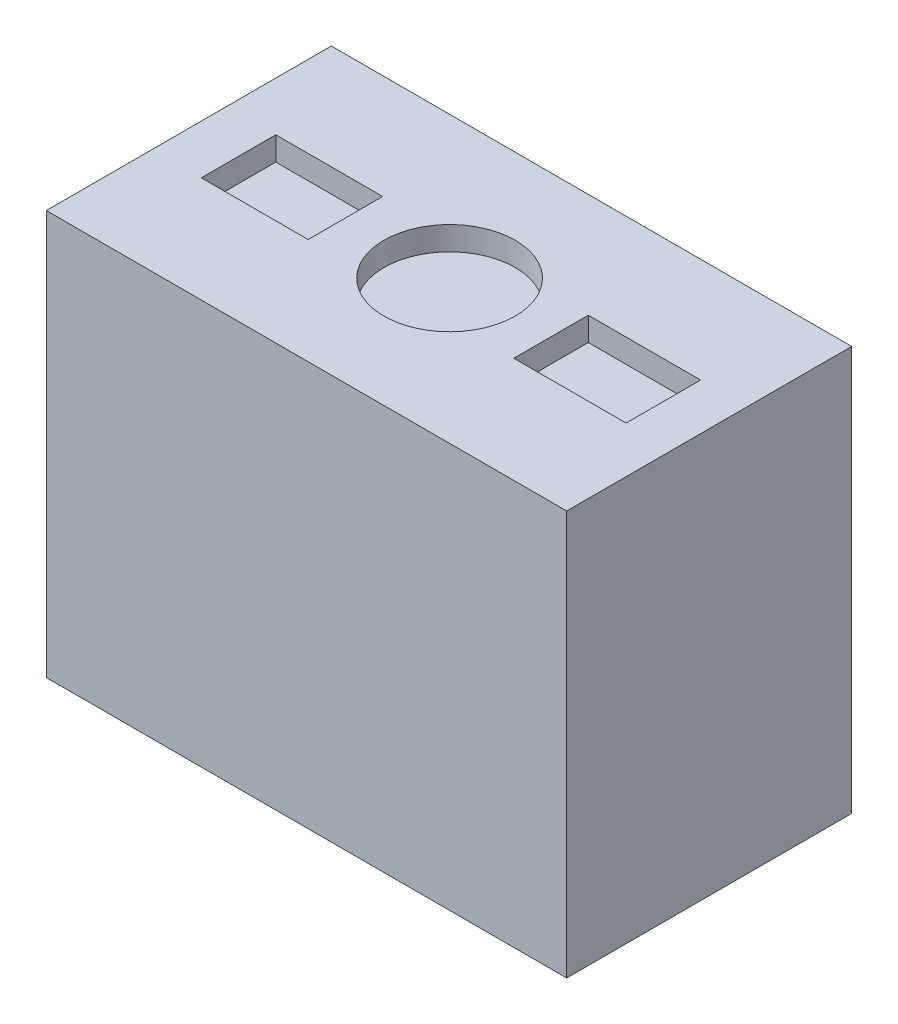
ISO-10303-21;
HEADER;
FILE_DESCRIPTION(('STEP AP214'),'2;1');
FILE_NAME('part.step','',(''),(''),'','','');
FILE_SCHEMA(('AUTOMOTIVE_DESIGN { 1 0 10303 214 1 1 1 1 }'));
ENDSEC;
DATA;
#1=APPLICATION_CONTEXT('core data for automotive mechanical design processes');
#2=APPLICATION_PROTOCOL_DEFINITION('international standard','automotive_design',2000,#1);
#3=PRODUCT_CONTEXT('',#1,'mechanical');
#4=PRODUCT('Part','Part','',(#3));
#5=PRODUCT_RELATED_PRODUCT_CATEGORY('part','',(#4));
#6=PRODUCT_DEFINITION_FORMATION('','',#4);
#7=PRODUCT_DEFINITION_CONTEXT('part definition',#1,'design');
#8=PRODUCT_DEFINITION('design','',#6,#7);
#9=PRODUCT_DEFINITION_SHAPE('','',#8);
#10=(LENGTH_UNIT() NAMED_UNIT(*) SI_UNIT(.MILLI.,.METRE.));
#11=(NAMED_UNIT(*) PLANE_ANGLE_UNIT() SI_UNIT($,.RADIAN.));
#12=(NAMED_UNIT(*) SI_UNIT($,.STERADIAN.) SOLID_ANGLE_UNIT());
#13=UNCERTAINTY_MEASURE_WITH_UNIT(LENGTH_MEASURE(1.E-05),#10,'distance_accuracy_value','');
#14=(GEOMETRIC_REPRESENTATION_CONTEXT(3) GLOBAL_UNCERTAINTY_ASSIGNED_CONTEXT((#13)) GLOBAL_UNIT_ASSIGNED_CONTEXT((#10,
#11,#12)) REPRESENTATION_CONTEXT('',''));
#15=CARTESIAN_POINT('',(0.,0.,0.));
#16=DIRECTION('',(0.,0.,1.));
#17=DIRECTION('',(1.,0.,0.));
#18=AXIS2_PLACEMENT_3D('',#15,#16,#17);
#19=CARTESIAN_POINT('',(-11.,8.55,12.05));
#20=DIRECTION('',(0.,-1.,0.));
#21=DIRECTION('',(0.,0.,-1.));
#22=AXIS2_PLACEMENT_3D('',#19,#20,#21);
#23=PLANE('',#22);
#24=CARTESIAN_POINT('',(0.,8.55,6.));
#25=DIRECTION('',(0.,-1.,0.));
#26=DIRECTION('',(0.,0.,-1.));
#27=AXIS2_PLACEMENT_3D('',#24,#25,#26);
#28=CIRCLE('',#27,2.77735612961279);
#29=CARTESIAN_POINT('',(0.,8.55,3.22264387038721));
#30=VERTEX_POINT('',#29);
#31=EDGE_CURVE('E157',#30,#30,#28,.T.);
#32=ORIENTED_EDGE('',*,*,#31,.T.);
#33=EDGE_LOOP('',(#32));
#34=FACE_BOUND('',#33,.T.);
#35=DIRECTION('',(-1.,0.,0.));
#36=VECTOR('',#35,1.);
#37=CARTESIAN_POINT('',(-11.,8.55,0.));
#38=LINE('',#37,#36);
#39=CARTESIAN_POINT('',(11.,8.55,0.));
#40=VERTEX_POINT('',#39);
#41=CARTESIAN_POINT('',(-11.,8.55,0.));
#42=VERTEX_POINT('',#41);
#43=EDGE_CURVE('E209',#40,#42,#38,.T.);
#44=ORIENTED_EDGE('',*,*,#43,.T.);
#45=DIRECTION('',(0.,0.,-1.));
#46=VECTOR('',#45,1.);
#47=CARTESIAN_POINT('',(-11.,8.55,12.05));
#48=LINE('',#47,#46);
#49=CARTESIAN_POINT('',(-11.,8.55,12.05));
#50=VERTEX_POINT('',#49);
#51=EDGE_CURVE('E40',#50,#42,#48,.T.);
#52=ORIENTED_EDGE('',*,*,#51,.F.);
#53=DIRECTION('',(-1.,0.,0.));
#54=VECTOR('',#53,1.);
#55=CARTESIAN_POINT('',(-11.,8.55,12.05));
#56=LINE('',#55,#54);
#57=CARTESIAN_POINT('',(11.,8.55,12.05));
#58=VERTEX_POINT('',#57);
#59=EDGE_CURVE('E199',#58,#50,#56,.T.);
#60=ORIENTED_EDGE('',*,*,#59,.F.);
#61=DIRECTION('',(0.,0.,-1.));
#62=VECTOR('',#61,1.);
#63=CARTESIAN_POINT('',(11.,8.55,12.05));
#64=LINE('',#63,#62);
#65=EDGE_CURVE('E11',#58,#40,#64,.T.);
#66=ORIENTED_EDGE('',*,*,#65,.T.);
#67=EDGE_LOOP('',(#44,#52,#60,#66));
#68=FACE_BOUND('',#67,.T.);
#69=DIRECTION('',(0.,0.,-1.));
#70=VECTOR('',#69,1.);
#71=CARTESIAN_POINT('',(9.03660388727996,8.55,12.05));
#72=LINE('',#71,#70);
#73=CARTESIAN_POINT('',(9.03660388727996,8.55,7.57455976823817));
#74=VERTEX_POINT('',#73);
#75=CARTESIAN_POINT('',(9.03660388727996,8.55,4.42544023176183));
#76=VERTEX_POINT('',#75);
#77=EDGE_CURVE('E150',#74,#76,#72,.T.);
#78=ORIENTED_EDGE('',*,*,#77,.F.);
#79=DIRECTION('',(1.,0.,0.));
#80=VECTOR('',#79,1.);
#81=CARTESIAN_POINT('',(-11.,8.55,7.57455976823817));
#82=LINE('',#81,#80);
#83=CARTESIAN_POINT('',(4.29010487577937,8.55,7.57455976823817));
#84=VERTEX_POINT('',#83);
#85=EDGE_CURVE('E55',#84,#74,#82,.T.);
#86=ORIENTED_EDGE('',*,*,#85,.F.);
#87=DIRECTION('',(0.,0.,1.));
#88=VECTOR('',#87,1.);
#89=CARTESIAN_POINT('',(4.29010487577937,8.55,12.05));
#90=LINE('',#89,#88);
#91=CARTESIAN_POINT('',(4.29010487577937,8.55,4.42544023176183));
#92=VERTEX_POINT('',#91);
#93=EDGE_CURVE('E141',#92,#84,#90,.T.);
#94=ORIENTED_EDGE('',*,*,#93,.F.);
#95=DIRECTION('',(-1.,0.,0.));
#96=VECTOR('',#95,1.);
#97=CARTESIAN_POINT('',(-11.,8.55,4.42544023176183));
#98=LINE('',#97,#96);
#99=EDGE_CURVE('E144',#76,#92,#98,.T.);
#100=ORIENTED_EDGE('',*,*,#99,.F.);
#101=EDGE_LOOP('',(#78,#86,#94,#100));
#102=FACE_BOUND('',#101,.T.);
#103=DIRECTION('',(0.,0.,-1.));
#104=VECTOR('',#103,1.);
#105=CARTESIAN_POINT('',(-4.40420340970967,8.55,12.05));
#106=LINE('',#105,#104);
#107=CARTESIAN_POINT('',(-4.40420340970967,8.55,7.57455976823817));
#108=VERTEX_POINT('',#107);
#109=CARTESIAN_POINT('',(-4.40420340970967,8.55,4.42544023176183));
#110=VERTEX_POINT('',#109);
#111=EDGE_CURVE('E176',#108,#110,#106,.T.);
#112=ORIENTED_EDGE('',*,*,#111,.F.);
#113=DIRECTION('',(1.,0.,0.));
#114=VECTOR('',#113,1.);
#115=CARTESIAN_POINT('',(-11.,8.55,7.57455976823817));
#116=LINE('',#115,#114);
#117=CARTESIAN_POINT('',(-8.92250535334965,8.55,7.57455976823817));
#118=VERTEX_POINT('',#117);
#119=EDGE_CURVE('E47',#118,#108,#116,.T.);
#120=ORIENTED_EDGE('',*,*,#119,.F.);
#121=DIRECTION('',(0.,0.,1.));
#122=VECTOR('',#121,1.);
#123=CARTESIAN_POINT('',(-8.92250535334965,8.55,12.05));
#124=LINE('',#123,#122);
#125=CARTESIAN_POINT('',(-8.92250535334965,8.55,4.42544023176183));
#126=VERTEX_POINT('',#125);
#127=EDGE_CURVE('E165',#126,#118,#124,.T.);
#128=ORIENTED_EDGE('',*,*,#127,.F.);
#129=DIRECTION('',(-1.,0.,0.));
#130=VECTOR('',#129,1.);
#131=CARTESIAN_POINT('',(-11.,8.55,4.42544023176183));
#132=LINE('',#131,#130);
#133=EDGE_CURVE('E179',#110,#126,#132,.T.);
#134=ORIENTED_EDGE('',*,*,#133,.F.);
#135=EDGE_LOOP('',(#112,#120,#128,#134));
#136=FACE_BOUND('',#135,.T.);
#137=ADVANCED_FACE('F32',(#34,#68,#102,#136),#23,.F.);
#138=CARTESIAN_POINT('',(11.,-8.55,12.05));
#139=DIRECTION('',(-1.,0.,0.));
#140=DIRECTION('',(0.,0.,1.));
#141=AXIS2_PLACEMENT_3D('',#138,#139,#140);
#142=PLANE('',#141);
#143=DIRECTION('',(0.,1.,0.));
#144=VECTOR('',#143,1.);
#145=CARTESIAN_POINT('',(11.,-8.55,0.));
#146=LINE('',#145,#144);
#147=CARTESIAN_POINT('',(11.,-8.55,0.));
#148=VERTEX_POINT('',#147);
#149=EDGE_CURVE('E193',#148,#40,#146,.T.);
#150=ORIENTED_EDGE('',*,*,#149,.T.);
#151=ORIENTED_EDGE('',*,*,#65,.F.);
#152=DIRECTION('',(0.,1.,0.));
#153=VECTOR('',#152,1.);
#154=CARTESIAN_POINT('',(11.,-8.55,12.05));
#155=LINE('',#154,#153);
#156=CARTESIAN_POINT('',(11.,-8.55,12.05));
#157=VERTEX_POINT('',#156);
#158=EDGE_CURVE('E196',#157,#58,#155,.T.);
#159=ORIENTED_EDGE('',*,*,#158,.F.);
#160=DIRECTION('',(0.,0.,-1.));
#161=VECTOR('',#160,1.);
#162=CARTESIAN_POINT('',(11.,-8.55,12.05));
#163=LINE('',#162,#161);
#164=EDGE_CURVE('E206',#157,#148,#163,.T.);
#165=ORIENTED_EDGE('',*,*,#164,.T.);
#166=EDGE_LOOP('',(#150,#151,#159,#165));
#167=FACE_BOUND('',#166,.T.);
#168=ADVANCED_FACE('F34',(#167),#142,.F.);
#169=CARTESIAN_POINT('',(-11.,-8.55,12.05));
#170=DIRECTION('',(1.,0.,0.));
#171=DIRECTION('',(0.,0.,-1.));
#172=AXIS2_PLACEMENT_3D('',#169,#170,#171);
#173=PLANE('',#172);
#174=DIRECTION('',(0.,-1.,0.));
#175=VECTOR('',#174,1.);
#176=CARTESIAN_POINT('',(-11.,-8.55,0.));
#177=LINE('',#176,#175);
#178=CARTESIAN_POINT('',(-11.,-8.55,0.));
#179=VERTEX_POINT('',#178);
#180=EDGE_CURVE('E211',#42,#179,#177,.T.);
#181=ORIENTED_EDGE('',*,*,#180,.T.);
#182=DIRECTION('',(0.,0.,-1.));
#183=VECTOR('',#182,1.);
#184=CARTESIAN_POINT('',(-11.,-8.55,12.05));
#185=LINE('',#184,#183);
#186=CARTESIAN_POINT('',(-11.,-8.55,12.05));
#187=VERTEX_POINT('',#186);
#188=EDGE_CURVE('E216',#187,#179,#185,.T.);
#189=ORIENTED_EDGE('',*,*,#188,.F.);
#190=DIRECTION('',(0.,-1.,0.));
#191=VECTOR('',#190,1.);
#192=CARTESIAN_POINT('',(-11.,-8.55,12.05));
#193=LINE('',#192,#191);
#194=EDGE_CURVE('E202',#50,#187,#193,.T.);
#195=ORIENTED_EDGE('',*,*,#194,.F.);
#196=ORIENTED_EDGE('',*,*,#51,.T.);
#197=EDGE_LOOP('',(#181,#189,#195,#196));
#198=FACE_BOUND('',#197,.T.);
#199=ADVANCED_FACE('F223',(#198),#173,.F.);
#200=CARTESIAN_POINT('',(-11.,-8.55,12.05));
#201=DIRECTION('',(0.,1.,0.));
#202=DIRECTION('',(0.,0.,1.));
#203=AXIS2_PLACEMENT_3D('',#200,#201,#202);
#204=PLANE('',#203);
#205=DIRECTION('',(1.,0.,0.));
#206=VECTOR('',#205,1.);
#207=CARTESIAN_POINT('',(-11.,-8.55,0.));
#208=LINE('',#207,#206);
#209=EDGE_CURVE('E200',#179,#148,#208,.T.);
#210=ORIENTED_EDGE('',*,*,#209,.T.);
#211=ORIENTED_EDGE('',*,*,#164,.F.);
#212=DIRECTION('',(1.,0.,0.));
#213=VECTOR('',#212,1.);
#214=CARTESIAN_POINT('',(-11.,-8.55,12.05));
#215=LINE('',#214,#213);
#216=EDGE_CURVE('E204',#187,#157,#215,.T.);
#217=ORIENTED_EDGE('',*,*,#216,.F.);
#218=ORIENTED_EDGE('',*,*,#188,.T.);
#219=EDGE_LOOP('',(#210,#211,#217,#218));
#220=FACE_BOUND('',#219,.T.);
#221=ADVANCED_FACE('F232',(#220),#204,.F.);
#222=CARTESIAN_POINT('',(0.,0.,12.05));
#223=DIRECTION('',(0.,0.,-1.));
#224=DIRECTION('',(-1.,0.,0.));
#225=AXIS2_PLACEMENT_3D('',#222,#223,#224);
#226=PLANE('',#225);
#227=ORIENTED_EDGE('',*,*,#158,.T.);
#228=ORIENTED_EDGE('',*,*,#59,.T.);
#229=ORIENTED_EDGE('',*,*,#194,.T.);
#230=ORIENTED_EDGE('',*,*,#216,.T.);
#231=EDGE_LOOP('',(#227,#228,#229,#230));
#232=FACE_BOUND('',#231,.T.);
#233=ADVANCED_FACE('F238',(#232),#226,.F.);
#234=CARTESIAN_POINT('',(0.,0.,0.));
#235=DIRECTION('',(0.,0.,-1.));
#236=DIRECTION('',(-1.,0.,0.));
#237=AXIS2_PLACEMENT_3D('',#234,#235,#236);
#238=PLANE('',#237);
#239=ORIENTED_EDGE('',*,*,#149,.F.);
#240=ORIENTED_EDGE('',*,*,#209,.F.);
#241=ORIENTED_EDGE('',*,*,#180,.F.);
#242=ORIENTED_EDGE('',*,*,#43,.F.);
#243=EDGE_LOOP('',(#239,#240,#241,#242));
#244=FACE_BOUND('',#243,.T.);
#245=ADVANCED_FACE('F229',(#244),#238,.T.);
#246=CARTESIAN_POINT('',(0.,7.55,6.));
#247=DIRECTION('',(0.,1.,0.));
#248=DIRECTION('',(0.,0.,1.));
#249=AXIS2_PLACEMENT_3D('',#246,#247,#248);
#250=CYLINDRICAL_SURFACE('',#249,2.77735612961279);
#251=CARTESIAN_POINT('',(0.,7.55,6.));
#252=DIRECTION('',(0.,-1.,0.));
#253=DIRECTION('',(0.,0.,-1.));
#254=AXIS2_PLACEMENT_3D('',#251,#252,#253);
#255=CIRCLE('',#254,2.77735612961279);
#256=CARTESIAN_POINT('',(0.,7.55,3.22264387038721));
#257=VERTEX_POINT('',#256);
#258=EDGE_CURVE('E190',#257,#257,#255,.T.);
#259=ORIENTED_EDGE('',*,*,#258,.T.);
#260=EDGE_LOOP('',(#259));
#261=FACE_BOUND('',#260,.T.);
#262=ORIENTED_EDGE('',*,*,#31,.F.);
#263=EDGE_LOOP('',(#262));
#264=FACE_BOUND('',#263,.T.);
#265=ADVANCED_FACE('F275',(#261,#264),#250,.F.);
#266=CARTESIAN_POINT('',(0.,7.55,6.));
#267=DIRECTION('',(0.,-1.,0.));
#268=DIRECTION('',(0.,0.,-1.));
#269=AXIS2_PLACEMENT_3D('',#266,#267,#268);
#270=PLANE('',#269);
#271=ORIENTED_EDGE('',*,*,#258,.F.);
#272=EDGE_LOOP('',(#271));
#273=FACE_BOUND('',#272,.T.);
#274=ADVANCED_FACE('F272',(#273),#270,.F.);
#275=CARTESIAN_POINT('',(-11.,7.55,7.57455976823817));
#276=DIRECTION('',(0.,0.,1.));
#277=DIRECTION('',(1.,0.,0.));
#278=AXIS2_PLACEMENT_3D('',#275,#276,#277);
#279=PLANE('',#278);
#280=ORIENTED_EDGE('',*,*,#85,.T.);
#281=DIRECTION('',(0.,1.,0.));
#282=VECTOR('',#281,1.);
#283=CARTESIAN_POINT('',(9.03660388727996,7.55,7.57455976823817));
#284=LINE('',#283,#282);
#285=CARTESIAN_POINT('',(9.03660388727996,7.55,7.57455976823817));
#286=VERTEX_POINT('',#285);
#287=EDGE_CURVE('E119',#286,#74,#284,.T.);
#288=ORIENTED_EDGE('',*,*,#287,.F.);
#289=DIRECTION('',(1.,0.,0.));
#290=VECTOR('',#289,1.);
#291=CARTESIAN_POINT('',(-11.,7.55,7.57455976823817));
#292=LINE('',#291,#290);
#293=CARTESIAN_POINT('',(4.29010487577937,7.55,7.57455976823817));
#294=VERTEX_POINT('',#293);
#295=EDGE_CURVE('E123',#294,#286,#292,.T.);
#296=ORIENTED_EDGE('',*,*,#295,.F.);
#297=DIRECTION('',(0.,1.,0.));
#298=VECTOR('',#297,1.);
#299=CARTESIAN_POINT('',(4.29010487577937,7.55,7.57455976823817));
#300=LINE('',#299,#298);
#301=EDGE_CURVE('E155',#294,#84,#300,.T.);
#302=ORIENTED_EDGE('',*,*,#301,.T.);
#303=EDGE_LOOP('',(#280,#288,#296,#302));
#304=FACE_BOUND('',#303,.T.);
#305=ADVANCED_FACE('F121',(#304),#279,.F.);
#306=CARTESIAN_POINT('',(4.29010487577937,7.55,12.05));
#307=DIRECTION('',(-1.,0.,0.));
#308=DIRECTION('',(0.,0.,1.));
#309=AXIS2_PLACEMENT_3D('',#306,#307,#308);
#310=PLANE('',#309);
#311=ORIENTED_EDGE('',*,*,#93,.T.);
#312=ORIENTED_EDGE('',*,*,#301,.F.);
#313=DIRECTION('',(0.,0.,1.));
#314=VECTOR('',#313,1.);
#315=CARTESIAN_POINT('',(4.29010487577937,7.55,12.05));
#316=LINE('',#315,#314);
#317=CARTESIAN_POINT('',(4.29010487577937,7.55,4.42544023176183));
#318=VERTEX_POINT('',#317);
#319=EDGE_CURVE('E129',#318,#294,#316,.T.);
#320=ORIENTED_EDGE('',*,*,#319,.F.);
#321=DIRECTION('',(0.,1.,0.));
#322=VECTOR('',#321,1.);
#323=CARTESIAN_POINT('',(4.29010487577937,7.55,4.42544023176183));
#324=LINE('',#323,#322);
#325=EDGE_CURVE('E158',#318,#92,#324,.T.);
#326=ORIENTED_EDGE('',*,*,#325,.T.);
#327=EDGE_LOOP('',(#311,#312,#320,#326));
#328=FACE_BOUND('',#327,.T.);
#329=ADVANCED_FACE('F321',(#328),#310,.F.);
#330=CARTESIAN_POINT('',(-11.,7.55,4.42544023176183));
#331=DIRECTION('',(0.,0.,-1.));
#332=DIRECTION('',(-1.,0.,0.));
#333=AXIS2_PLACEMENT_3D('',#330,#331,#332);
#334=PLANE('',#333);
#335=ORIENTED_EDGE('',*,*,#99,.T.);
#336=ORIENTED_EDGE('',*,*,#325,.F.);
#337=DIRECTION('',(-1.,0.,0.));
#338=VECTOR('',#337,1.);
#339=CARTESIAN_POINT('',(-11.,7.55,4.42544023176183));
#340=LINE('',#339,#338);
#341=CARTESIAN_POINT('',(9.03660388727996,7.55,4.42544023176183));
#342=VERTEX_POINT('',#341);
#343=EDGE_CURVE('E137',#342,#318,#340,.T.);
#344=ORIENTED_EDGE('',*,*,#343,.F.);
#345=DIRECTION('',(0.,1.,0.));
#346=VECTOR('',#345,1.);
#347=CARTESIAN_POINT('',(9.03660388727996,7.55,4.42544023176183));
#348=LINE('',#347,#346);
#349=EDGE_CURVE('E128',#342,#76,#348,.T.);
#350=ORIENTED_EDGE('',*,*,#349,.T.);
#351=EDGE_LOOP('',(#335,#336,#344,#350));
#352=FACE_BOUND('',#351,.T.);
#353=ADVANCED_FACE('F330',(#352),#334,.F.);
#354=CARTESIAN_POINT('',(9.03660388727996,7.55,12.05));
#355=DIRECTION('',(1.,0.,0.));
#356=DIRECTION('',(0.,0.,-1.));
#357=AXIS2_PLACEMENT_3D('',#354,#355,#356);
#358=PLANE('',#357);
#359=ORIENTED_EDGE('',*,*,#77,.T.);
#360=ORIENTED_EDGE('',*,*,#349,.F.);
#361=DIRECTION('',(0.,0.,-1.));
#362=VECTOR('',#361,1.);
#363=CARTESIAN_POINT('',(9.03660388727996,7.55,12.05));
#364=LINE('',#363,#362);
#365=EDGE_CURVE('E132',#286,#342,#364,.T.);
#366=ORIENTED_EDGE('',*,*,#365,.F.);
#367=ORIENTED_EDGE('',*,*,#287,.T.);
#368=EDGE_LOOP('',(#359,#360,#366,#367));
#369=FACE_BOUND('',#368,.T.);
#370=ADVANCED_FACE('F133',(#369),#358,.F.);
#371=CARTESIAN_POINT('',(0.,7.55,0.));
#372=DIRECTION('',(0.,1.,0.));
#373=DIRECTION('',(0.,0.,1.));
#374=AXIS2_PLACEMENT_3D('',#371,#372,#373);
#375=PLANE('',#374);
#376=ORIENTED_EDGE('',*,*,#295,.T.);
#377=ORIENTED_EDGE('',*,*,#365,.T.);
#378=ORIENTED_EDGE('',*,*,#343,.T.);
#379=ORIENTED_EDGE('',*,*,#319,.T.);
#380=EDGE_LOOP('',(#376,#377,#378,#379));
#381=FACE_BOUND('',#380,.T.);
#382=ADVANCED_FACE('F139',(#381),#375,.T.);
#383=CARTESIAN_POINT('',(-11.,7.55,7.57455976823817));
#384=DIRECTION('',(0.,0.,1.));
#385=DIRECTION('',(1.,0.,0.));
#386=AXIS2_PLACEMENT_3D('',#383,#384,#385);
#387=PLANE('',#386);
#388=ORIENTED_EDGE('',*,*,#119,.T.);
#389=DIRECTION('',(0.,1.,0.));
#390=VECTOR('',#389,1.);
#391=CARTESIAN_POINT('',(-4.40420340970967,7.55,7.57455976823817));
#392=LINE('',#391,#390);
#393=CARTESIAN_POINT('',(-4.40420340970967,7.55,7.57455976823817));
#394=VERTEX_POINT('',#393);
#395=EDGE_CURVE('E174',#394,#108,#392,.T.);
#396=ORIENTED_EDGE('',*,*,#395,.F.);
#397=DIRECTION('',(1.,0.,0.));
#398=VECTOR('',#397,1.);
#399=CARTESIAN_POINT('',(-11.,7.55,7.57455976823817));
#400=LINE('',#399,#398);
#401=CARTESIAN_POINT('',(-8.92250535334965,7.55,7.57455976823817));
#402=VERTEX_POINT('',#401);
#403=EDGE_CURVE('E161',#402,#394,#400,.T.);
#404=ORIENTED_EDGE('',*,*,#403,.F.);
#405=DIRECTION('',(0.,1.,0.));
#406=VECTOR('',#405,1.);
#407=CARTESIAN_POINT('',(-8.92250535334965,7.55,7.57455976823817));
#408=LINE('',#407,#406);
#409=EDGE_CURVE('E151',#402,#118,#408,.T.);
#410=ORIENTED_EDGE('',*,*,#409,.T.);
#411=EDGE_LOOP('',(#388,#396,#404,#410));
#412=FACE_BOUND('',#411,.T.);
#413=ADVANCED_FACE('F252',(#412),#387,.F.);
#414=CARTESIAN_POINT('',(-8.92250535334965,7.55,12.05));
#415=DIRECTION('',(-1.,0.,0.));
#416=DIRECTION('',(0.,0.,1.));
#417=AXIS2_PLACEMENT_3D('',#414,#415,#416);
#418=PLANE('',#417);
#419=ORIENTED_EDGE('',*,*,#127,.T.);
#420=ORIENTED_EDGE('',*,*,#409,.F.);
#421=DIRECTION('',(0.,0.,1.));
#422=VECTOR('',#421,1.);
#423=CARTESIAN_POINT('',(-8.92250535334965,7.55,12.05));
#424=LINE('',#423,#422);
#425=CARTESIAN_POINT('',(-8.92250535334965,7.55,4.42544023176183));
#426=VERTEX_POINT('',#425);
#427=EDGE_CURVE('E171',#426,#402,#424,.T.);
#428=ORIENTED_EDGE('',*,*,#427,.F.);
#429=DIRECTION('',(0.,1.,0.));
#430=VECTOR('',#429,1.);
#431=CARTESIAN_POINT('',(-8.92250535334965,7.55,4.42544023176183));
#432=LINE('',#431,#430);
#433=EDGE_CURVE('E185',#426,#126,#432,.T.);
#434=ORIENTED_EDGE('',*,*,#433,.T.);
#435=EDGE_LOOP('',(#419,#420,#428,#434));
#436=FACE_BOUND('',#435,.T.);
#437=ADVANCED_FACE('F257',(#436),#418,.F.);
#438=CARTESIAN_POINT('',(-11.,7.55,4.42544023176183));
#439=DIRECTION('',(0.,0.,-1.));
#440=DIRECTION('',(-1.,0.,0.));
#441=AXIS2_PLACEMENT_3D('',#438,#439,#440);
#442=PLANE('',#441);
#443=ORIENTED_EDGE('',*,*,#133,.T.);
#444=ORIENTED_EDGE('',*,*,#433,.F.);
#445=DIRECTION('',(-1.,0.,0.));
#446=VECTOR('',#445,1.);
#447=CARTESIAN_POINT('',(-11.,7.55,4.42544023176183));
#448=LINE('',#447,#446);
#449=CARTESIAN_POINT('',(-4.40420340970967,7.55,4.42544023176183));
#450=VERTEX_POINT('',#449);
#451=EDGE_CURVE('E168',#450,#426,#448,.T.);
#452=ORIENTED_EDGE('',*,*,#451,.F.);
#453=DIRECTION('',(0.,1.,0.));
#454=VECTOR('',#453,1.);
#455=CARTESIAN_POINT('',(-4.40420340970967,7.55,4.42544023176183));
#456=LINE('',#455,#454);
#457=EDGE_CURVE('E187',#450,#110,#456,.T.);
#458=ORIENTED_EDGE('',*,*,#457,.T.);
#459=EDGE_LOOP('',(#443,#444,#452,#458));
#460=FACE_BOUND('',#459,.T.);
#461=ADVANCED_FACE('F259',(#460),#442,.F.);
#462=CARTESIAN_POINT('',(-4.40420340970967,7.55,12.05));
#463=DIRECTION('',(1.,0.,0.));
#464=DIRECTION('',(0.,0.,-1.));
#465=AXIS2_PLACEMENT_3D('',#462,#463,#464);
#466=PLANE('',#465);
#467=ORIENTED_EDGE('',*,*,#111,.T.);
#468=ORIENTED_EDGE('',*,*,#457,.F.);
#469=DIRECTION('',(0.,0.,-1.));
#470=VECTOR('',#469,1.);
#471=CARTESIAN_POINT('',(-4.40420340970967,7.55,12.05));
#472=LINE('',#471,#470);
#473=EDGE_CURVE('E164',#394,#450,#472,.T.);
#474=ORIENTED_EDGE('',*,*,#473,.F.);
#475=ORIENTED_EDGE('',*,*,#395,.T.);
#476=EDGE_LOOP('',(#467,#468,#474,#475));
#477=FACE_BOUND('',#476,.T.);
#478=ADVANCED_FACE('F248',(#477),#466,.F.);
#479=CARTESIAN_POINT('',(0.,7.55,0.));
#480=DIRECTION('',(0.,1.,0.));
#481=DIRECTION('',(0.,0.,1.));
#482=AXIS2_PLACEMENT_3D('',#479,#480,#481);
#483=PLANE('',#482);
#484=ORIENTED_EDGE('',*,*,#403,.T.);
#485=ORIENTED_EDGE('',*,*,#473,.T.);
#486=ORIENTED_EDGE('',*,*,#451,.T.);
#487=ORIENTED_EDGE('',*,*,#427,.T.);
#488=EDGE_LOOP('',(#484,#485,#486,#487));
#489=FACE_BOUND('',#488,.T.);
#490=ADVANCED_FACE('F255',(#489),#483,.T.);
#491=CLOSED_SHELL('',(#137,#168,#199,#221,#233,#245,#265,#274,#305,#329,#353,#370,#382,#413,
#437,#461,#478,#490));
#492=MANIFOLD_SOLID_BREP('B2',#491);
#493=ADVANCED_BREP_SHAPE_REPRESENTATION('',(#18,#492),#14);
#494=SHAPE_DEFINITION_REPRESENTATION(#9,#493);
ENDSEC;
END-ISO-10303-21;
